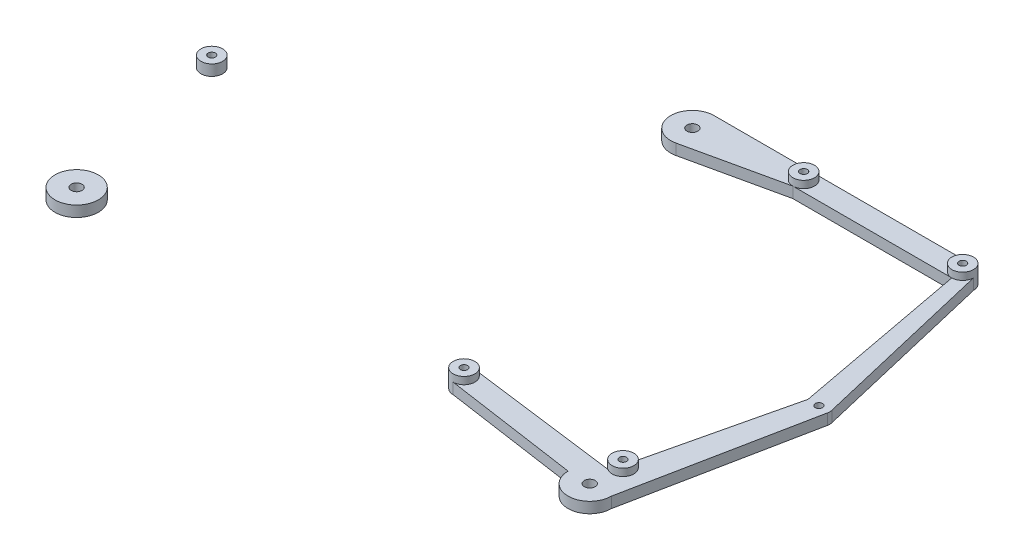
ISO-10303-21;
HEADER;
FILE_DESCRIPTION(('STEP AP214'),'2;1');
FILE_NAME('part.step','',(''),(''),'','','');
FILE_SCHEMA(('AUTOMOTIVE_DESIGN { 1 0 10303 214 1 1 1 1 }'));
ENDSEC;
DATA;
#1=APPLICATION_CONTEXT('core data for automotive mechanical design processes');
#2=APPLICATION_PROTOCOL_DEFINITION('international standard','automotive_design',2000,#1);
#3=PRODUCT_CONTEXT('',#1,'mechanical');
#4=PRODUCT('Part','Part','',(#3));
#5=PRODUCT_RELATED_PRODUCT_CATEGORY('part','',(#4));
#6=PRODUCT_DEFINITION_FORMATION('','',#4);
#7=PRODUCT_DEFINITION_CONTEXT('part definition',#1,'design');
#8=PRODUCT_DEFINITION('design','',#6,#7);
#9=PRODUCT_DEFINITION_SHAPE('','',#8);
#10=(LENGTH_UNIT() NAMED_UNIT(*) SI_UNIT(.MILLI.,.METRE.));
#11=(NAMED_UNIT(*) PLANE_ANGLE_UNIT() SI_UNIT($,.RADIAN.));
#12=(NAMED_UNIT(*) SI_UNIT($,.STERADIAN.) SOLID_ANGLE_UNIT());
#13=UNCERTAINTY_MEASURE_WITH_UNIT(LENGTH_MEASURE(1.E-05),#10,'distance_accuracy_value','');
#14=(GEOMETRIC_REPRESENTATION_CONTEXT(3) GLOBAL_UNCERTAINTY_ASSIGNED_CONTEXT((#13)) GLOBAL_UNIT_ASSIGNED_CONTEXT((#10,
#11,#12)) REPRESENTATION_CONTEXT('',''));
#15=CARTESIAN_POINT('',(0.,0.,0.));
#16=DIRECTION('',(0.,0.,1.));
#17=DIRECTION('',(1.,0.,0.));
#18=AXIS2_PLACEMENT_3D('',#15,#16,#17);
#19=CARTESIAN_POINT('',(-49.,56.5,38.35));
#20=DIRECTION('',(0.,1.,0.));
#21=DIRECTION('',(0.,0.,1.));
#22=AXIS2_PLACEMENT_3D('',#19,#20,#21);
#23=PLANE('',#22);
#24=CARTESIAN_POINT('',(-49.,56.5,38.35));
#25=DIRECTION('',(0.,1.,0.));
#26=DIRECTION('',(0.,0.,1.));
#27=AXIS2_PLACEMENT_3D('',#24,#25,#26);
#28=CIRCLE('',#27,3.);
#29=CARTESIAN_POINT('',(-49.,56.5,41.35));
#30=VERTEX_POINT('',#29);
#31=EDGE_CURVE('E11',#30,#30,#28,.T.);
#32=ORIENTED_EDGE('',*,*,#31,.T.);
#33=EDGE_LOOP('',(#32));
#34=FACE_BOUND('',#33,.T.);
#35=CARTESIAN_POINT('',(-49.,56.5,38.35));
#36=DIRECTION('',(0.,1.,0.));
#37=DIRECTION('',(0.,0.,1.));
#38=AXIS2_PLACEMENT_3D('',#35,#36,#37);
#39=CIRCLE('',#38,0.999999999999998);
#40=CARTESIAN_POINT('',(-49.,56.5,39.35));
#41=VERTEX_POINT('',#40);
#42=EDGE_CURVE('E58',#41,#41,#39,.T.);
#43=ORIENTED_EDGE('',*,*,#42,.F.);
#44=EDGE_LOOP('',(#43));
#45=FACE_BOUND('',#44,.T.);
#46=ADVANCED_FACE('F47',(#34,#45),#23,.T.);
#47=CARTESIAN_POINT('',(-49.,53.5,38.35));
#48=DIRECTION('',(0.,1.,0.));
#49=DIRECTION('',(0.,0.,1.));
#50=AXIS2_PLACEMENT_3D('',#47,#48,#49);
#51=PLANE('',#50);
#52=CARTESIAN_POINT('',(-49.,53.5,38.35));
#53=DIRECTION('',(0.,1.,0.));
#54=DIRECTION('',(0.,0.,1.));
#55=AXIS2_PLACEMENT_3D('',#52,#53,#54);
#56=CIRCLE('',#55,3.);
#57=CARTESIAN_POINT('',(-49.,53.5,41.35));
#58=VERTEX_POINT('',#57);
#59=EDGE_CURVE('E51',#58,#58,#56,.T.);
#60=ORIENTED_EDGE('',*,*,#59,.F.);
#61=EDGE_LOOP('',(#60));
#62=FACE_BOUND('',#61,.T.);
#63=CARTESIAN_POINT('',(-49.,53.5,38.35));
#64=DIRECTION('',(0.,1.,0.));
#65=DIRECTION('',(0.,0.,1.));
#66=AXIS2_PLACEMENT_3D('',#63,#64,#65);
#67=CIRCLE('',#66,0.999999999999998);
#68=CARTESIAN_POINT('',(-49.,53.5,39.35));
#69=VERTEX_POINT('',#68);
#70=EDGE_CURVE('E60',#69,#69,#67,.T.);
#71=ORIENTED_EDGE('',*,*,#70,.T.);
#72=EDGE_LOOP('',(#71));
#73=FACE_BOUND('',#72,.T.);
#74=ADVANCED_FACE('F70',(#62,#73),#51,.F.);
#75=CARTESIAN_POINT('',(-49.,56.5,38.35));
#76=DIRECTION('',(0.,-1.,0.));
#77=DIRECTION('',(0.,0.,-1.));
#78=AXIS2_PLACEMENT_3D('',#75,#76,#77);
#79=CYLINDRICAL_SURFACE('',#78,3.);
#80=ORIENTED_EDGE('',*,*,#31,.F.);
#81=EDGE_LOOP('',(#80));
#82=FACE_BOUND('',#81,.T.);
#83=ORIENTED_EDGE('',*,*,#59,.T.);
#84=EDGE_LOOP('',(#83));
#85=FACE_BOUND('',#84,.T.);
#86=ADVANCED_FACE('F49',(#82,#85),#79,.T.);
#87=CARTESIAN_POINT('',(-49.,56.5,38.35));
#88=DIRECTION('',(0.,-1.,0.));
#89=DIRECTION('',(0.,0.,-1.));
#90=AXIS2_PLACEMENT_3D('',#87,#88,#89);
#91=CYLINDRICAL_SURFACE('',#90,0.999999999999998);
#92=ORIENTED_EDGE('',*,*,#42,.T.);
#93=EDGE_LOOP('',(#92));
#94=FACE_BOUND('',#93,.T.);
#95=ORIENTED_EDGE('',*,*,#70,.F.);
#96=EDGE_LOOP('',(#95));
#97=FACE_BOUND('',#96,.T.);
#98=ADVANCED_FACE('F66',(#94,#97),#91,.F.);
#99=CLOSED_SHELL('',(#46,#74,#86,#98));
#100=MANIFOLD_SOLID_BREP('B2',#99);
#101=CARTESIAN_POINT('',(35.,56.5,-10.65));
#102=DIRECTION('',(0.,1.,0.));
#103=DIRECTION('',(0.,0.,1.));
#104=AXIS2_PLACEMENT_3D('',#101,#102,#103);
#105=PLANE('',#104);
#106=CARTESIAN_POINT('',(106.8,56.5,-13.65));
#107=DIRECTION('',(0.,1.,0.));
#108=DIRECTION('',(0.,0.,1.));
#109=AXIS2_PLACEMENT_3D('',#106,#107,#108);
#110=CIRCLE('',#109,3.00000000000001);
#111=CARTESIAN_POINT('',(106.8,56.5,-10.65));
#112=VERTEX_POINT('',#111);
#113=CARTESIAN_POINT('',(109.8,56.5,-13.65));
#114=VERTEX_POINT('',#113);
#115=EDGE_CURVE('E264',#112,#114,#110,.T.);
#116=ORIENTED_EDGE('',*,*,#115,.F.);
#117=DIRECTION('',(-0.184530735506142,0.,-0.982826743456629));
#118=VECTOR('',#117,1.);
#119=CARTESIAN_POINT('',(116.,56.5,38.35));
#120=LINE('',#119,#118);
#121=CARTESIAN_POINT('',(116.,56.5,38.35));
#122=VERTEX_POINT('',#121);
#123=EDGE_CURVE('E228',#122,#112,#120,.T.);
#124=ORIENTED_EDGE('',*,*,#123,.F.);
#125=DIRECTION('',(0.229595693571687,0.,-0.97328609231476));
#126=VECTOR('',#125,1.);
#127=CARTESIAN_POINT('',(106.8,56.5,77.35));
#128=LINE('',#127,#126);
#129=CARTESIAN_POINT('',(106.8,56.5,77.35));
#130=VERTEX_POINT('',#129);
#131=EDGE_CURVE('E250',#130,#122,#128,.T.);
#132=ORIENTED_EDGE('',*,*,#131,.F.);
#133=CARTESIAN_POINT('',(106.8,56.5,80.35));
#134=DIRECTION('',(0.,1.,0.));
#135=DIRECTION('',(0.,0.,1.));
#136=AXIS2_PLACEMENT_3D('',#133,#134,#135);
#137=CIRCLE('',#136,3.00000000000001);
#138=CARTESIAN_POINT('',(105.09529593426,56.5,82.8185996127867));
#139=VERTEX_POINT('',#138);
#140=EDGE_CURVE('E315',#139,#130,#137,.T.);
#141=ORIENTED_EDGE('',*,*,#140,.F.);
#142=DIRECTION('',(0.991669360604763,0.,0.128809468742559));
#143=VECTOR('',#142,1.);
#144=CARTESIAN_POINT('',(63.1864284062277,56.5,77.3749919181857));
#145=LINE('',#144,#143);
#146=CARTESIAN_POINT('',(63.1864284062277,56.5,77.3749919181857));
#147=VERTEX_POINT('',#146);
#148=EDGE_CURVE('E406',#147,#139,#145,.T.);
#149=ORIENTED_EDGE('',*,*,#148,.F.);
#150=CARTESIAN_POINT('',(62.8,56.5,80.35));
#151=DIRECTION('',(0.,1.,0.));
#152=DIRECTION('',(0.,0.,1.));
#153=AXIS2_PLACEMENT_3D('',#150,#151,#152);
#154=CIRCLE('',#153,3.00000000000001);
#155=CARTESIAN_POINT('',(62.8,56.5,83.35));
#156=VERTEX_POINT('',#155);
#157=EDGE_CURVE('E294',#156,#147,#154,.T.);
#158=ORIENTED_EDGE('',*,*,#157,.F.);
#159=DIRECTION('',(-0.989627736739852,0.,-0.143655639204171));
#160=VECTOR('',#159,1.);
#161=CARTESIAN_POINT('',(99.9999999999999,56.5,88.75));
#162=LINE('',#161,#160);
#163=CARTESIAN_POINT('',(99.9999999999999,56.5,88.75));
#164=VERTEX_POINT('',#163);
#165=EDGE_CURVE('E411',#164,#156,#162,.T.);
#166=ORIENTED_EDGE('',*,*,#165,.F.);
#167=CARTESIAN_POINT('',(106.,56.5,88.75));
#168=DIRECTION('',(0.,1.,0.));
#169=DIRECTION('',(0.,0.,1.));
#170=AXIS2_PLACEMENT_3D('',#167,#168,#169);
#171=CIRCLE('',#170,6.00000000000001);
#172=CARTESIAN_POINT('',(112.,56.5,88.75));
#173=VERTEX_POINT('',#172);
#174=EDGE_CURVE('E416',#173,#164,#171,.F.);
#175=ORIENTED_EDGE('',*,*,#174,.F.);
#176=DIRECTION('',(-0.195726385235334,0.,0.980658545122975));
#177=VECTOR('',#176,1.);
#178=CARTESIAN_POINT('',(112.,56.5,88.75));
#179=LINE('',#178,#177);
#180=CARTESIAN_POINT('',(121.941975635369,56.5,38.937179155706));
#181=VERTEX_POINT('',#180);
#182=EDGE_CURVE('E421',#181,#173,#179,.T.);
#183=ORIENTED_EDGE('',*,*,#182,.F.);
#184=CARTESIAN_POINT('',(119.,56.5,38.35));
#185=DIRECTION('',(0.,1.,0.));
#186=DIRECTION('',(0.,0.,1.));
#187=AXIS2_PLACEMENT_3D('',#184,#185,#186);
#188=CIRCLE('',#187,3.);
#189=CARTESIAN_POINT('',(121.9196588455,56.5,37.6603680504115));
#190=VERTEX_POINT('',#189);
#191=EDGE_CURVE('E426',#190,#181,#188,.F.);
#192=ORIENTED_EDGE('',*,*,#191,.F.);
#193=DIRECTION('',(0.229877316529491,0.,0.97321961516669));
#194=VECTOR('',#193,1.);
#195=CARTESIAN_POINT('',(109.8,56.5,-13.65));
#196=LINE('',#195,#194);
#197=EDGE_CURVE('E267',#114,#190,#196,.T.);
#198=ORIENTED_EDGE('',*,*,#197,.F.);
#199=EDGE_LOOP('',(#116,#124,#132,#141,#149,#158,#166,#175,#183,#192,#198));
#200=FACE_BOUND('',#199,.T.);
#201=CARTESIAN_POINT('',(119.,56.5,38.35));
#202=DIRECTION('',(0.,1.,0.));
#203=DIRECTION('',(0.,0.,1.));
#204=AXIS2_PLACEMENT_3D('',#201,#202,#203);
#205=CIRCLE('',#204,0.999999999999998);
#206=CARTESIAN_POINT('',(119.,56.5,39.35));
#207=VERTEX_POINT('',#206);
#208=EDGE_CURVE('E398',#207,#207,#205,.F.);
#209=ORIENTED_EDGE('',*,*,#208,.T.);
#210=EDGE_LOOP('',(#209));
#211=FACE_BOUND('',#210,.T.);
#212=CARTESIAN_POINT('',(106.,56.5,88.75));
#213=DIRECTION('',(0.,1.,0.));
#214=DIRECTION('',(0.,0.,1.));
#215=AXIS2_PLACEMENT_3D('',#212,#213,#214);
#216=CIRCLE('',#215,1.5);
#217=CARTESIAN_POINT('',(106.,56.5,90.25));
#218=VERTEX_POINT('',#217);
#219=EDGE_CURVE('E324',#218,#218,#216,.F.);
#220=ORIENTED_EDGE('',*,*,#219,.T.);
#221=EDGE_LOOP('',(#220));
#222=FACE_BOUND('',#221,.T.);
#223=ADVANCED_FACE('F116',(#200,#211,#222),#105,.T.);
#224=CARTESIAN_POINT('',(106.8,56.5,-16.65));
#225=VERTEX_POINT('',#224);
#226=EDGE_CURVE('E256',#225,#112,#110,.T.);
#227=ORIENTED_EDGE('',*,*,#226,.F.);
#228=DIRECTION('',(1.,0.,0.));
#229=VECTOR('',#228,1.);
#230=CARTESIAN_POINT('',(106.8,56.5,-16.65));
#231=LINE('',#230,#229);
#232=CARTESIAN_POINT('',(62.8,56.5,-16.65));
#233=VERTEX_POINT('',#232);
#234=EDGE_CURVE('E437',#233,#225,#231,.T.);
#235=ORIENTED_EDGE('',*,*,#234,.F.);
#236=CARTESIAN_POINT('',(62.8,56.5,-13.65));
#237=DIRECTION('',(0.,1.,0.));
#238=DIRECTION('',(0.,0.,1.));
#239=AXIS2_PLACEMENT_3D('',#236,#237,#238);
#240=CIRCLE('',#239,3.00000000000001);
#241=CARTESIAN_POINT('',(62.8,56.5,-10.65));
#242=VERTEX_POINT('',#241);
#243=EDGE_CURVE('E259',#242,#233,#240,.T.);
#244=ORIENTED_EDGE('',*,*,#243,.F.);
#245=DIRECTION('',(-1.,0.,0.));
#246=VECTOR('',#245,1.);
#247=CARTESIAN_POINT('',(62.8,56.5,-10.65));
#248=LINE('',#247,#246);
#249=EDGE_CURVE('E244',#112,#242,#248,.T.);
#250=ORIENTED_EDGE('',*,*,#249,.F.);
#251=EDGE_LOOP('',(#227,#235,#244,#250));
#252=FACE_BOUND('',#251,.T.);
#253=ADVANCED_FACE('F254',(#252),#105,.T.);
#254=EDGE_CURVE('E132',#233,#242,#240,.T.);
#255=ORIENTED_EDGE('',*,*,#254,.F.);
#256=CARTESIAN_POINT('',(35.,56.5,-16.65));
#257=VERTEX_POINT('',#256);
#258=EDGE_CURVE('E434',#257,#233,#231,.T.);
#259=ORIENTED_EDGE('',*,*,#258,.F.);
#260=CARTESIAN_POINT('',(35.,56.5,-10.65));
#261=DIRECTION('',(0.,1.,0.));
#262=DIRECTION('',(0.,0.,1.));
#263=AXIS2_PLACEMENT_3D('',#260,#261,#262);
#264=CIRCLE('',#263,5.99999999999999);
#265=CARTESIAN_POINT('',(36.294964028777,56.5,-4.79141073600707));
#266=VERTEX_POINT('',#265);
#267=EDGE_CURVE('E45',#257,#266,#264,.T.);
#268=ORIENTED_EDGE('',*,*,#267,.T.);
#269=DIRECTION('',(-0.976431543998829,0.,0.215827338129495));
#270=VECTOR('',#269,1.);
#271=CARTESIAN_POINT('',(36.294964028777,56.5,-4.79141073600707));
#272=LINE('',#271,#270);
#273=EDGE_CURVE('E438',#242,#266,#272,.T.);
#274=ORIENTED_EDGE('',*,*,#273,.F.);
#275=EDGE_LOOP('',(#255,#259,#268,#274));
#276=FACE_BOUND('',#275,.T.);
#277=CARTESIAN_POINT('',(35.,56.5,-10.65));
#278=DIRECTION('',(0.,1.,0.));
#279=DIRECTION('',(0.,0.,1.));
#280=AXIS2_PLACEMENT_3D('',#277,#278,#279);
#281=CIRCLE('',#280,1.5);
#282=CARTESIAN_POINT('',(35.,56.5,-9.15000000000002));
#283=VERTEX_POINT('',#282);
#284=EDGE_CURVE('E472',#283,#283,#281,.T.);
#285=ORIENTED_EDGE('',*,*,#284,.F.);
#286=EDGE_LOOP('',(#285));
#287=FACE_BOUND('',#286,.T.);
#288=ADVANCED_FACE('F499',(#276,#287),#105,.T.);
#289=CARTESIAN_POINT('',(35.,53.5,-10.65));
#290=DIRECTION('',(0.,1.,0.));
#291=DIRECTION('',(0.,0.,1.));
#292=AXIS2_PLACEMENT_3D('',#289,#290,#291);
#293=PLANE('',#292);
#294=DIRECTION('',(1.,0.,0.));
#295=VECTOR('',#294,1.);
#296=CARTESIAN_POINT('',(106.8,53.5,-16.65));
#297=LINE('',#296,#295);
#298=CARTESIAN_POINT('',(35.,53.5,-16.65));
#299=VERTEX_POINT('',#298);
#300=CARTESIAN_POINT('',(106.8,53.5,-16.65));
#301=VERTEX_POINT('',#300);
#302=EDGE_CURVE('E345',#299,#301,#297,.T.);
#303=ORIENTED_EDGE('',*,*,#302,.T.);
#304=CARTESIAN_POINT('',(106.8,53.5,-13.65));
#305=DIRECTION('',(0.,-1.,0.));
#306=DIRECTION('',(0.,0.,-1.));
#307=AXIS2_PLACEMENT_3D('',#304,#305,#306);
#308=CIRCLE('',#307,3.00000000000001);
#309=CARTESIAN_POINT('',(109.8,53.5,-13.65));
#310=VERTEX_POINT('',#309);
#311=EDGE_CURVE('E341',#301,#310,#308,.T.);
#312=ORIENTED_EDGE('',*,*,#311,.T.);
#313=DIRECTION('',(0.229877316529491,0.,0.97321961516669));
#314=VECTOR('',#313,1.);
#315=CARTESIAN_POINT('',(109.8,53.5,-13.65));
#316=LINE('',#315,#314);
#317=CARTESIAN_POINT('',(121.9196588455,53.5,37.6603680504115));
#318=VERTEX_POINT('',#317);
#319=EDGE_CURVE('E337',#310,#318,#316,.T.);
#320=ORIENTED_EDGE('',*,*,#319,.T.);
#321=CARTESIAN_POINT('',(119.,53.5,38.35));
#322=DIRECTION('',(0.,-1.,0.));
#323=DIRECTION('',(0.,0.,-1.));
#324=AXIS2_PLACEMENT_3D('',#321,#322,#323);
#325=CIRCLE('',#324,3.);
#326=CARTESIAN_POINT('',(121.941975635369,53.5,38.937179155706));
#327=VERTEX_POINT('',#326);
#328=EDGE_CURVE('E333',#318,#327,#325,.T.);
#329=ORIENTED_EDGE('',*,*,#328,.T.);
#330=DIRECTION('',(-0.195726385235334,0.,0.980658545122975));
#331=VECTOR('',#330,1.);
#332=CARTESIAN_POINT('',(112.,53.5,88.75));
#333=LINE('',#332,#331);
#334=CARTESIAN_POINT('',(112.,53.5,88.75));
#335=VERTEX_POINT('',#334);
#336=EDGE_CURVE('E329',#327,#335,#333,.T.);
#337=ORIENTED_EDGE('',*,*,#336,.T.);
#338=CARTESIAN_POINT('',(106.,53.5,88.75));
#339=DIRECTION('',(0.,-1.,0.));
#340=DIRECTION('',(0.,0.,-1.));
#341=AXIS2_PLACEMENT_3D('',#338,#339,#340);
#342=CIRCLE('',#341,6.00000000000001);
#343=CARTESIAN_POINT('',(99.9999999999999,53.5,88.75));
#344=VERTEX_POINT('',#343);
#345=EDGE_CURVE('E325',#335,#344,#342,.T.);
#346=ORIENTED_EDGE('',*,*,#345,.T.);
#347=DIRECTION('',(-0.989627736739852,0.,-0.143655639204171));
#348=VECTOR('',#347,1.);
#349=CARTESIAN_POINT('',(99.9999999999999,53.5,88.75));
#350=LINE('',#349,#348);
#351=CARTESIAN_POINT('',(62.8,53.5,83.35));
#352=VERTEX_POINT('',#351);
#353=EDGE_CURVE('E320',#344,#352,#350,.T.);
#354=ORIENTED_EDGE('',*,*,#353,.T.);
#355=CARTESIAN_POINT('',(62.8,53.5,80.35));
#356=DIRECTION('',(0.,-1.,0.));
#357=DIRECTION('',(0.,0.,-1.));
#358=AXIS2_PLACEMENT_3D('',#355,#356,#357);
#359=CIRCLE('',#358,3.);
#360=CARTESIAN_POINT('',(63.1864284062277,53.5,77.3749919181857));
#361=VERTEX_POINT('',#360);
#362=EDGE_CURVE('E369',#352,#361,#359,.T.);
#363=ORIENTED_EDGE('',*,*,#362,.T.);
#364=DIRECTION('',(0.991669360604763,0.,0.128809468742559));
#365=VECTOR('',#364,1.);
#366=CARTESIAN_POINT('',(63.1864284062277,53.5,77.3749919181857));
#367=LINE('',#366,#365);
#368=CARTESIAN_POINT('',(105.09529593426,53.5,82.8185996127867));
#369=VERTEX_POINT('',#368);
#370=EDGE_CURVE('E365',#361,#369,#367,.T.);
#371=ORIENTED_EDGE('',*,*,#370,.T.);
#372=CARTESIAN_POINT('',(106.8,53.5,80.35));
#373=DIRECTION('',(0.,-1.,0.));
#374=DIRECTION('',(0.,0.,-1.));
#375=AXIS2_PLACEMENT_3D('',#372,#373,#374);
#376=CIRCLE('',#375,3.00000000000001);
#377=CARTESIAN_POINT('',(106.8,53.5,77.35));
#378=VERTEX_POINT('',#377);
#379=EDGE_CURVE('E361',#369,#378,#376,.T.);
#380=ORIENTED_EDGE('',*,*,#379,.T.);
#381=DIRECTION('',(0.229595693571687,0.,-0.97328609231476));
#382=VECTOR('',#381,1.);
#383=CARTESIAN_POINT('',(106.8,53.5,77.35));
#384=LINE('',#383,#382);
#385=CARTESIAN_POINT('',(116.,53.5,38.35));
#386=VERTEX_POINT('',#385);
#387=EDGE_CURVE('E357',#378,#386,#384,.T.);
#388=ORIENTED_EDGE('',*,*,#387,.T.);
#389=DIRECTION('',(-0.184530735506142,0.,-0.982826743456629));
#390=VECTOR('',#389,1.);
#391=CARTESIAN_POINT('',(116.,53.5,38.35));
#392=LINE('',#391,#390);
#393=CARTESIAN_POINT('',(106.8,53.5,-10.65));
#394=VERTEX_POINT('',#393);
#395=EDGE_CURVE('E354',#386,#394,#392,.T.);
#396=ORIENTED_EDGE('',*,*,#395,.T.);
#397=DIRECTION('',(-1.,0.,0.));
#398=VECTOR('',#397,1.);
#399=CARTESIAN_POINT('',(62.8,53.5,-10.65));
#400=LINE('',#399,#398);
#401=CARTESIAN_POINT('',(62.8,53.5,-10.65));
#402=VERTEX_POINT('',#401);
#403=EDGE_CURVE('E247',#394,#402,#400,.T.);
#404=ORIENTED_EDGE('',*,*,#403,.T.);
#405=DIRECTION('',(-0.976431543998829,0.,0.215827338129495));
#406=VECTOR('',#405,1.);
#407=CARTESIAN_POINT('',(36.294964028777,53.5,-4.79141073600707));
#408=LINE('',#407,#406);
#409=CARTESIAN_POINT('',(36.294964028777,53.5,-4.79141073600707));
#410=VERTEX_POINT('',#409);
#411=EDGE_CURVE('E348',#402,#410,#408,.T.);
#412=ORIENTED_EDGE('',*,*,#411,.T.);
#413=CARTESIAN_POINT('',(35.,53.5,-10.65));
#414=DIRECTION('',(0.,1.,0.));
#415=DIRECTION('',(0.,0.,1.));
#416=AXIS2_PLACEMENT_3D('',#413,#414,#415);
#417=CIRCLE('',#416,5.99999999999999);
#418=EDGE_CURVE('E120',#299,#410,#417,.T.);
#419=ORIENTED_EDGE('',*,*,#418,.F.);
#420=EDGE_LOOP('',(#303,#312,#320,#329,#337,#346,#354,#363,#371,#380,#388,#396,#404,#412,#419));
#421=FACE_BOUND('',#420,.T.);
#422=CARTESIAN_POINT('',(35.,53.5,-10.65));
#423=DIRECTION('',(0.,1.,0.));
#424=DIRECTION('',(0.,0.,1.));
#425=AXIS2_PLACEMENT_3D('',#422,#423,#424);
#426=CIRCLE('',#425,1.5);
#427=CARTESIAN_POINT('',(35.,53.5,-9.15000000000002));
#428=VERTEX_POINT('',#427);
#429=EDGE_CURVE('E402',#428,#428,#426,.T.);
#430=ORIENTED_EDGE('',*,*,#429,.T.);
#431=EDGE_LOOP('',(#430));
#432=FACE_BOUND('',#431,.T.);
#433=CARTESIAN_POINT('',(62.8,53.5,-13.65));
#434=DIRECTION('',(0.,-1.,0.));
#435=DIRECTION('',(0.,0.,-1.));
#436=AXIS2_PLACEMENT_3D('',#433,#434,#435);
#437=CIRCLE('',#436,0.999999999999998);
#438=CARTESIAN_POINT('',(62.8,53.5,-14.65));
#439=VERTEX_POINT('',#438);
#440=EDGE_CURVE('E383',#439,#439,#437,.T.);
#441=ORIENTED_EDGE('',*,*,#440,.F.);
#442=EDGE_LOOP('',(#441));
#443=FACE_BOUND('',#442,.T.);
#444=CARTESIAN_POINT('',(106.8,53.5,-13.65));
#445=DIRECTION('',(0.,-1.,0.));
#446=DIRECTION('',(0.,0.,-1.));
#447=AXIS2_PLACEMENT_3D('',#444,#445,#446);
#448=CIRCLE('',#447,0.999999999999998);
#449=CARTESIAN_POINT('',(106.8,53.5,-14.65));
#450=VERTEX_POINT('',#449);
#451=EDGE_CURVE('E378',#450,#450,#448,.T.);
#452=ORIENTED_EDGE('',*,*,#451,.F.);
#453=EDGE_LOOP('',(#452));
#454=FACE_BOUND('',#453,.T.);
#455=CARTESIAN_POINT('',(62.8,53.5,80.35));
#456=DIRECTION('',(0.,-1.,0.));
#457=DIRECTION('',(0.,0.,-1.));
#458=AXIS2_PLACEMENT_3D('',#455,#456,#457);
#459=CIRCLE('',#458,0.999999999999998);
#460=CARTESIAN_POINT('',(62.8,53.5,79.35));
#461=VERTEX_POINT('',#460);
#462=EDGE_CURVE('E373',#461,#461,#459,.T.);
#463=ORIENTED_EDGE('',*,*,#462,.F.);
#464=EDGE_LOOP('',(#463));
#465=FACE_BOUND('',#464,.T.);
#466=CARTESIAN_POINT('',(106.8,53.5,80.35));
#467=DIRECTION('',(0.,-1.,0.));
#468=DIRECTION('',(0.,0.,-1.));
#469=AXIS2_PLACEMENT_3D('',#466,#467,#468);
#470=CIRCLE('',#469,0.999999999999998);
#471=CARTESIAN_POINT('',(106.8,53.5,79.35));
#472=VERTEX_POINT('',#471);
#473=EDGE_CURVE('E391',#472,#472,#470,.T.);
#474=ORIENTED_EDGE('',*,*,#473,.F.);
#475=EDGE_LOOP('',(#474));
#476=FACE_BOUND('',#475,.T.);
#477=CARTESIAN_POINT('',(106.,53.5,88.75));
#478=DIRECTION('',(0.,-1.,0.));
#479=DIRECTION('',(0.,0.,-1.));
#480=AXIS2_PLACEMENT_3D('',#477,#478,#479);
#481=CIRCLE('',#480,1.5);
#482=CARTESIAN_POINT('',(106.,53.5,87.25));
#483=VERTEX_POINT('',#482);
#484=EDGE_CURVE('E387',#483,#483,#481,.T.);
#485=ORIENTED_EDGE('',*,*,#484,.F.);
#486=EDGE_LOOP('',(#485));
#487=FACE_BOUND('',#486,.T.);
#488=CARTESIAN_POINT('',(119.,53.5,38.35));
#489=DIRECTION('',(0.,-1.,0.));
#490=DIRECTION('',(0.,0.,-1.));
#491=AXIS2_PLACEMENT_3D('',#488,#489,#490);
#492=CIRCLE('',#491,0.999999999999998);
#493=CARTESIAN_POINT('',(119.,53.5,37.35));
#494=VERTEX_POINT('',#493);
#495=EDGE_CURVE('E374',#494,#494,#492,.T.);
#496=ORIENTED_EDGE('',*,*,#495,.F.);
#497=EDGE_LOOP('',(#496));
#498=FACE_BOUND('',#497,.T.);
#499=ADVANCED_FACE('F480',(#421,#432,#443,#454,#465,#476,#487,#498),#293,.F.);
#500=CARTESIAN_POINT('',(35.,56.5,-10.65));
#501=DIRECTION('',(0.,-1.,0.));
#502=DIRECTION('',(0.,0.,-1.));
#503=AXIS2_PLACEMENT_3D('',#500,#501,#502);
#504=CYLINDRICAL_SURFACE('',#503,5.99999999999999);
#505=ORIENTED_EDGE('',*,*,#267,.F.);
#506=DIRECTION('',(0.,-1.,0.));
#507=VECTOR('',#506,1.);
#508=CARTESIAN_POINT('',(35.,201.61705619947,-16.65));
#509=LINE('',#508,#507);
#510=EDGE_CURVE('E140',#257,#299,#509,.T.);
#511=ORIENTED_EDGE('',*,*,#510,.T.);
#512=ORIENTED_EDGE('',*,*,#418,.T.);
#513=DIRECTION('',(0.,-1.,0.));
#514=VECTOR('',#513,1.);
#515=CARTESIAN_POINT('',(36.294964028777,201.61705619947,-4.79141073600707));
#516=LINE('',#515,#514);
#517=EDGE_CURVE('E261',#266,#410,#516,.T.);
#518=ORIENTED_EDGE('',*,*,#517,.F.);
#519=EDGE_LOOP('',(#505,#511,#512,#518));
#520=FACE_BOUND('',#519,.T.);
#521=ADVANCED_FACE('F118',(#520),#504,.T.);
#522=CARTESIAN_POINT('',(35.,56.5,-10.65));
#523=DIRECTION('',(0.,-1.,0.));
#524=DIRECTION('',(0.,0.,-1.));
#525=AXIS2_PLACEMENT_3D('',#522,#523,#524);
#526=CYLINDRICAL_SURFACE('',#525,1.5);
#527=ORIENTED_EDGE('',*,*,#284,.T.);
#528=EDGE_LOOP('',(#527));
#529=FACE_BOUND('',#528,.T.);
#530=ORIENTED_EDGE('',*,*,#429,.F.);
#531=EDGE_LOOP('',(#530));
#532=FACE_BOUND('',#531,.T.);
#533=ADVANCED_FACE('F483',(#529,#532),#526,.F.);
#534=CARTESIAN_POINT('',(62.8,201.61705619947,80.35));
#535=DIRECTION('',(0.,-1.,0.));
#536=DIRECTION('',(0.,0.,-1.));
#537=AXIS2_PLACEMENT_3D('',#534,#535,#536);
#538=CYLINDRICAL_SURFACE('',#537,3.);
#539=DIRECTION('',(0.,-1.,0.));
#540=VECTOR('',#539,1.);
#541=CARTESIAN_POINT('',(62.8,201.61705619947,83.35));
#542=LINE('',#541,#540);
#543=EDGE_CURVE('E415',#156,#352,#542,.T.);
#544=ORIENTED_EDGE('',*,*,#543,.F.);
#545=ORIENTED_EDGE('',*,*,#157,.T.);
#546=DIRECTION('',(0.,-1.,0.));
#547=VECTOR('',#546,1.);
#548=CARTESIAN_POINT('',(63.1864284062277,201.61705619947,77.3749919181857));
#549=LINE('',#548,#547);
#550=EDGE_CURVE('E319',#147,#361,#549,.T.);
#551=ORIENTED_EDGE('',*,*,#550,.T.);
#552=ORIENTED_EDGE('',*,*,#362,.F.);
#553=EDGE_LOOP('',(#544,#545,#551,#552));
#554=FACE_BOUND('',#553,.T.);
#555=CARTESIAN_POINT('',(62.8,58.5,80.35));
#556=DIRECTION('',(0.,1.,0.));
#557=DIRECTION('',(0.,0.,1.));
#558=AXIS2_PLACEMENT_3D('',#555,#556,#557);
#559=CIRCLE('',#558,3.00000000000001);
#560=CARTESIAN_POINT('',(62.8,58.5,83.35));
#561=VERTEX_POINT('',#560);
#562=EDGE_CURVE('E290',#561,#561,#559,.T.);
#563=ORIENTED_EDGE('',*,*,#562,.F.);
#564=EDGE_LOOP('',(#563));
#565=FACE_BOUND('',#564,.T.);
#566=ADVANCED_FACE('F485',(#554,#565),#538,.T.);
#567=CARTESIAN_POINT('',(99.9999999999999,201.61705619947,88.75));
#568=DIRECTION('',(-0.143655639204171,0.,0.989627736739852));
#569=DIRECTION('',(0.989627736739852,0.,0.143655639204171));
#570=AXIS2_PLACEMENT_3D('',#567,#568,#569);
#571=PLANE('',#570);
#572=DIRECTION('',(0.,-1.,0.));
#573=VECTOR('',#572,1.);
#574=CARTESIAN_POINT('',(99.9999999999999,201.61705619947,88.75));
#575=LINE('',#574,#573);
#576=EDGE_CURVE('E420',#164,#344,#575,.T.);
#577=ORIENTED_EDGE('',*,*,#576,.F.);
#578=ORIENTED_EDGE('',*,*,#165,.T.);
#579=ORIENTED_EDGE('',*,*,#543,.T.);
#580=ORIENTED_EDGE('',*,*,#353,.F.);
#581=EDGE_LOOP('',(#577,#578,#579,#580));
#582=FACE_BOUND('',#581,.T.);
#583=ADVANCED_FACE('F492',(#582),#571,.T.);
#584=CARTESIAN_POINT('',(106.,201.61705619947,88.75));
#585=DIRECTION('',(0.,-1.,0.));
#586=DIRECTION('',(0.,0.,-1.));
#587=AXIS2_PLACEMENT_3D('',#584,#585,#586);
#588=CYLINDRICAL_SURFACE('',#587,6.00000000000001);
#589=DIRECTION('',(0.,-1.,0.));
#590=VECTOR('',#589,1.);
#591=CARTESIAN_POINT('',(112.,201.61705619947,88.75));
#592=LINE('',#591,#590);
#593=EDGE_CURVE('E425',#173,#335,#592,.T.);
#594=ORIENTED_EDGE('',*,*,#593,.F.);
#595=ORIENTED_EDGE('',*,*,#174,.T.);
#596=ORIENTED_EDGE('',*,*,#576,.T.);
#597=ORIENTED_EDGE('',*,*,#345,.F.);
#598=EDGE_LOOP('',(#594,#595,#596,#597));
#599=FACE_BOUND('',#598,.T.);
#600=ADVANCED_FACE('F529',(#599),#588,.T.);
#601=CARTESIAN_POINT('',(112.,201.61705619947,88.75));
#602=DIRECTION('',(0.980658545122975,0.,0.195726385235334));
#603=DIRECTION('',(0.195726385235334,0.,-0.980658545122975));
#604=AXIS2_PLACEMENT_3D('',#601,#602,#603);
#605=PLANE('',#604);
#606=DIRECTION('',(0.,-1.,0.));
#607=VECTOR('',#606,1.);
#608=CARTESIAN_POINT('',(121.941975635369,201.61705619947,38.937179155706));
#609=LINE('',#608,#607);
#610=EDGE_CURVE('E430',#181,#327,#609,.T.);
#611=ORIENTED_EDGE('',*,*,#610,.F.);
#612=ORIENTED_EDGE('',*,*,#182,.T.);
#613=ORIENTED_EDGE('',*,*,#593,.T.);
#614=ORIENTED_EDGE('',*,*,#336,.F.);
#615=EDGE_LOOP('',(#611,#612,#613,#614));
#616=FACE_BOUND('',#615,.T.);
#617=ADVANCED_FACE('F525',(#616),#605,.T.);
#618=CARTESIAN_POINT('',(119.,201.61705619947,38.35));
#619=DIRECTION('',(0.,-1.,0.));
#620=DIRECTION('',(0.,0.,-1.));
#621=AXIS2_PLACEMENT_3D('',#618,#619,#620);
#622=CYLINDRICAL_SURFACE('',#621,3.);
#623=DIRECTION('',(0.,-1.,0.));
#624=VECTOR('',#623,1.);
#625=CARTESIAN_POINT('',(121.9196588455,201.61705619947,37.6603680504115));
#626=LINE('',#625,#624);
#627=EDGE_CURVE('E433',#190,#318,#626,.T.);
#628=ORIENTED_EDGE('',*,*,#627,.F.);
#629=ORIENTED_EDGE('',*,*,#191,.T.);
#630=ORIENTED_EDGE('',*,*,#610,.T.);
#631=ORIENTED_EDGE('',*,*,#328,.F.);
#632=EDGE_LOOP('',(#628,#629,#630,#631));
#633=FACE_BOUND('',#632,.T.);
#634=ADVANCED_FACE('F522',(#633),#622,.T.);
#635=CARTESIAN_POINT('',(109.8,201.61705619947,-13.65));
#636=DIRECTION('',(0.97321961516669,0.,-0.229877316529491));
#637=DIRECTION('',(-0.229877316529491,0.,-0.97321961516669));
#638=AXIS2_PLACEMENT_3D('',#635,#636,#637);
#639=PLANE('',#638);
#640=DIRECTION('',(0.,-1.,0.));
#641=VECTOR('',#640,1.);
#642=CARTESIAN_POINT('',(109.8,201.61705619947,-13.65));
#643=LINE('',#642,#641);
#644=EDGE_CURVE('E453',#114,#310,#643,.T.);
#645=ORIENTED_EDGE('',*,*,#644,.F.);
#646=ORIENTED_EDGE('',*,*,#197,.T.);
#647=ORIENTED_EDGE('',*,*,#627,.T.);
#648=ORIENTED_EDGE('',*,*,#319,.F.);
#649=EDGE_LOOP('',(#645,#646,#647,#648));
#650=FACE_BOUND('',#649,.T.);
#651=ADVANCED_FACE('F517',(#650),#639,.T.);
#652=CARTESIAN_POINT('',(106.8,201.61705619947,-13.65));
#653=DIRECTION('',(0.,-1.,0.));
#654=DIRECTION('',(0.,0.,-1.));
#655=AXIS2_PLACEMENT_3D('',#652,#653,#654);
#656=CYLINDRICAL_SURFACE('',#655,3.00000000000001);
#657=DIRECTION('',(0.,-1.,0.));
#658=VECTOR('',#657,1.);
#659=CARTESIAN_POINT('',(106.8,201.61705619947,-16.65));
#660=LINE('',#659,#658);
#661=EDGE_CURVE('E278',#225,#301,#660,.T.);
#662=ORIENTED_EDGE('',*,*,#661,.F.);
#663=ORIENTED_EDGE('',*,*,#226,.T.);
#664=ORIENTED_EDGE('',*,*,#115,.T.);
#665=ORIENTED_EDGE('',*,*,#644,.T.);
#666=ORIENTED_EDGE('',*,*,#311,.F.);
#667=EDGE_LOOP('',(#662,#663,#664,#665,#666));
#668=FACE_BOUND('',#667,.T.);
#669=CARTESIAN_POINT('',(106.8,58.5,-13.65));
#670=DIRECTION('',(0.,1.,0.));
#671=DIRECTION('',(0.,0.,1.));
#672=AXIS2_PLACEMENT_3D('',#669,#670,#671);
#673=CIRCLE('',#672,3.00000000000001);
#674=CARTESIAN_POINT('',(106.8,58.5,-10.65));
#675=VERTEX_POINT('',#674);
#676=EDGE_CURVE('E280',#675,#675,#673,.T.);
#677=ORIENTED_EDGE('',*,*,#676,.F.);
#678=EDGE_LOOP('',(#677));
#679=FACE_BOUND('',#678,.T.);
#680=ADVANCED_FACE('F274',(#668,#679),#656,.T.);
#681=CARTESIAN_POINT('',(106.8,201.61705619947,-16.65));
#682=DIRECTION('',(0.,0.,-1.));
#683=DIRECTION('',(-1.,0.,0.));
#684=AXIS2_PLACEMENT_3D('',#681,#682,#683);
#685=PLANE('',#684);
#686=ORIENTED_EDGE('',*,*,#258,.T.);
#687=ORIENTED_EDGE('',*,*,#234,.T.);
#688=ORIENTED_EDGE('',*,*,#661,.T.);
#689=ORIENTED_EDGE('',*,*,#302,.F.);
#690=ORIENTED_EDGE('',*,*,#510,.F.);
#691=EDGE_LOOP('',(#686,#687,#688,#689,#690));
#692=FACE_BOUND('',#691,.T.);
#693=ADVANCED_FACE('F514',(#692),#685,.T.);
#694=CARTESIAN_POINT('',(36.294964028777,201.61705619947,-4.79141073600707));
#695=DIRECTION('',(0.215827338129495,0.,0.976431543998829));
#696=DIRECTION('',(0.976431543998829,0.,-0.215827338129495));
#697=AXIS2_PLACEMENT_3D('',#694,#695,#696);
#698=PLANE('',#697);
#699=DIRECTION('',(0.,-1.,0.));
#700=VECTOR('',#699,1.);
#701=CARTESIAN_POINT('',(62.8,201.61705619947,-10.65));
#702=LINE('',#701,#700);
#703=EDGE_CURVE('E239',#242,#402,#702,.T.);
#704=ORIENTED_EDGE('',*,*,#703,.F.);
#705=ORIENTED_EDGE('',*,*,#273,.T.);
#706=ORIENTED_EDGE('',*,*,#517,.T.);
#707=ORIENTED_EDGE('',*,*,#411,.F.);
#708=EDGE_LOOP('',(#704,#705,#706,#707));
#709=FACE_BOUND('',#708,.T.);
#710=ADVANCED_FACE('F624',(#709),#698,.T.);
#711=CARTESIAN_POINT('',(62.8,201.61705619947,-10.65));
#712=DIRECTION('',(0.,0.,1.));
#713=DIRECTION('',(1.,0.,0.));
#714=AXIS2_PLACEMENT_3D('',#711,#712,#713);
#715=PLANE('',#714);
#716=DIRECTION('',(0.,-1.,0.));
#717=VECTOR('',#716,1.);
#718=CARTESIAN_POINT('',(106.8,201.61705619947,-10.65));
#719=LINE('',#718,#717);
#720=EDGE_CURVE('E232',#112,#394,#719,.T.);
#721=ORIENTED_EDGE('',*,*,#720,.F.);
#722=ORIENTED_EDGE('',*,*,#249,.T.);
#723=ORIENTED_EDGE('',*,*,#703,.T.);
#724=ORIENTED_EDGE('',*,*,#403,.F.);
#725=EDGE_LOOP('',(#721,#722,#723,#724));
#726=FACE_BOUND('',#725,.T.);
#727=ADVANCED_FACE('F243',(#726),#715,.T.);
#728=CARTESIAN_POINT('',(116.,201.61705619947,38.35));
#729=DIRECTION('',(-0.982826743456629,0.,0.184530735506142));
#730=DIRECTION('',(0.184530735506142,0.,0.982826743456629));
#731=AXIS2_PLACEMENT_3D('',#728,#729,#730);
#732=PLANE('',#731);
#733=DIRECTION('',(0.,-1.,0.));
#734=VECTOR('',#733,1.);
#735=CARTESIAN_POINT('',(116.,201.61705619947,38.35));
#736=LINE('',#735,#734);
#737=EDGE_CURVE('E234',#122,#386,#736,.T.);
#738=ORIENTED_EDGE('',*,*,#737,.F.);
#739=ORIENTED_EDGE('',*,*,#123,.T.);
#740=ORIENTED_EDGE('',*,*,#720,.T.);
#741=ORIENTED_EDGE('',*,*,#395,.F.);
#742=EDGE_LOOP('',(#738,#739,#740,#741));
#743=FACE_BOUND('',#742,.T.);
#744=ADVANCED_FACE('F230',(#743),#732,.T.);
#745=CARTESIAN_POINT('',(106.8,201.61705619947,77.35));
#746=DIRECTION('',(-0.97328609231476,0.,-0.229595693571687));
#747=DIRECTION('',(-0.229595693571687,0.,0.97328609231476));
#748=AXIS2_PLACEMENT_3D('',#745,#746,#747);
#749=PLANE('',#748);
#750=DIRECTION('',(0.,-1.,0.));
#751=VECTOR('',#750,1.);
#752=CARTESIAN_POINT('',(106.8,201.61705619947,77.35));
#753=LINE('',#752,#751);
#754=EDGE_CURVE('E410',#130,#378,#753,.T.);
#755=ORIENTED_EDGE('',*,*,#754,.F.);
#756=ORIENTED_EDGE('',*,*,#131,.T.);
#757=ORIENTED_EDGE('',*,*,#737,.T.);
#758=ORIENTED_EDGE('',*,*,#387,.F.);
#759=EDGE_LOOP('',(#755,#756,#757,#758));
#760=FACE_BOUND('',#759,.T.);
#761=ADVANCED_FACE('F549',(#760),#749,.T.);
#762=CARTESIAN_POINT('',(106.8,201.61705619947,80.35));
#763=DIRECTION('',(0.,-1.,0.));
#764=DIRECTION('',(0.,0.,-1.));
#765=AXIS2_PLACEMENT_3D('',#762,#763,#764);
#766=CYLINDRICAL_SURFACE('',#765,3.00000000000001);
#767=DIRECTION('',(0.,-1.,0.));
#768=VECTOR('',#767,1.);
#769=CARTESIAN_POINT('',(105.09529593426,201.61705619947,82.8185996127867));
#770=LINE('',#769,#768);
#771=EDGE_CURVE('E379',#139,#369,#770,.T.);
#772=ORIENTED_EDGE('',*,*,#771,.F.);
#773=ORIENTED_EDGE('',*,*,#140,.T.);
#774=ORIENTED_EDGE('',*,*,#754,.T.);
#775=ORIENTED_EDGE('',*,*,#379,.F.);
#776=EDGE_LOOP('',(#772,#773,#774,#775));
#777=FACE_BOUND('',#776,.T.);
#778=CARTESIAN_POINT('',(106.8,58.5,80.35));
#779=DIRECTION('',(0.,1.,0.));
#780=DIRECTION('',(0.,0.,1.));
#781=AXIS2_PLACEMENT_3D('',#778,#779,#780);
#782=CIRCLE('',#781,3.00000000000001);
#783=CARTESIAN_POINT('',(106.8,58.5,83.35));
#784=VERTEX_POINT('',#783);
#785=EDGE_CURVE('E311',#784,#784,#782,.T.);
#786=ORIENTED_EDGE('',*,*,#785,.F.);
#787=EDGE_LOOP('',(#786));
#788=FACE_BOUND('',#787,.T.);
#789=ADVANCED_FACE('F544',(#777,#788),#766,.T.);
#790=CARTESIAN_POINT('',(63.1864284062277,201.61705619947,77.3749919181857));
#791=DIRECTION('',(0.128809468742559,0.,-0.991669360604763));
#792=DIRECTION('',(-0.991669360604763,0.,-0.128809468742559));
#793=AXIS2_PLACEMENT_3D('',#790,#791,#792);
#794=PLANE('',#793);
#795=ORIENTED_EDGE('',*,*,#550,.F.);
#796=ORIENTED_EDGE('',*,*,#148,.T.);
#797=ORIENTED_EDGE('',*,*,#771,.T.);
#798=ORIENTED_EDGE('',*,*,#370,.F.);
#799=EDGE_LOOP('',(#795,#796,#797,#798));
#800=FACE_BOUND('',#799,.T.);
#801=ADVANCED_FACE('F540',(#800),#794,.T.);
#802=CARTESIAN_POINT('',(119.,201.61705619947,38.35));
#803=DIRECTION('',(0.,-1.,0.));
#804=DIRECTION('',(0.,0.,-1.));
#805=AXIS2_PLACEMENT_3D('',#802,#803,#804);
#806=CYLINDRICAL_SURFACE('',#805,0.999999999999998);
#807=ORIENTED_EDGE('',*,*,#495,.T.);
#808=EDGE_LOOP('',(#807));
#809=FACE_BOUND('',#808,.T.);
#810=ORIENTED_EDGE('',*,*,#208,.F.);
#811=EDGE_LOOP('',(#810));
#812=FACE_BOUND('',#811,.T.);
#813=ADVANCED_FACE('F585',(#809,#812),#806,.F.);
#814=CARTESIAN_POINT('',(106.8,201.61705619947,-13.65));
#815=DIRECTION('',(0.,-1.,0.));
#816=DIRECTION('',(0.,0.,-1.));
#817=AXIS2_PLACEMENT_3D('',#814,#815,#816);
#818=CYLINDRICAL_SURFACE('',#817,0.999999999999998);
#819=ORIENTED_EDGE('',*,*,#451,.T.);
#820=EDGE_LOOP('',(#819));
#821=FACE_BOUND('',#820,.T.);
#822=CARTESIAN_POINT('',(106.8,58.5,-13.65));
#823=DIRECTION('',(0.,1.,0.));
#824=DIRECTION('',(0.,0.,1.));
#825=AXIS2_PLACEMENT_3D('',#822,#823,#824);
#826=CIRCLE('',#825,0.999999999999998);
#827=CARTESIAN_POINT('',(106.8,58.5,-12.65));
#828=VERTEX_POINT('',#827);
#829=EDGE_CURVE('E283',#828,#828,#826,.T.);
#830=ORIENTED_EDGE('',*,*,#829,.T.);
#831=EDGE_LOOP('',(#830));
#832=FACE_BOUND('',#831,.T.);
#833=ADVANCED_FACE('F575',(#821,#832),#818,.F.);
#834=CARTESIAN_POINT('',(62.8,201.61705619947,-13.65));
#835=DIRECTION('',(0.,-1.,0.));
#836=DIRECTION('',(0.,0.,-1.));
#837=AXIS2_PLACEMENT_3D('',#834,#835,#836);
#838=CYLINDRICAL_SURFACE('',#837,0.999999999999998);
#839=ORIENTED_EDGE('',*,*,#440,.T.);
#840=EDGE_LOOP('',(#839));
#841=FACE_BOUND('',#840,.T.);
#842=CARTESIAN_POINT('',(62.8,58.5,-13.65));
#843=DIRECTION('',(0.,1.,0.));
#844=DIRECTION('',(0.,0.,1.));
#845=AXIS2_PLACEMENT_3D('',#842,#843,#844);
#846=CIRCLE('',#845,0.999999999999998);
#847=CARTESIAN_POINT('',(62.8,58.5,-12.65));
#848=VERTEX_POINT('',#847);
#849=EDGE_CURVE('E297',#848,#848,#846,.T.);
#850=ORIENTED_EDGE('',*,*,#849,.T.);
#851=EDGE_LOOP('',(#850));
#852=FACE_BOUND('',#851,.T.);
#853=ADVANCED_FACE('F572',(#841,#852),#838,.F.);
#854=CARTESIAN_POINT('',(106.,201.61705619947,88.75));
#855=DIRECTION('',(0.,-1.,0.));
#856=DIRECTION('',(0.,0.,-1.));
#857=AXIS2_PLACEMENT_3D('',#854,#855,#856);
#858=CYLINDRICAL_SURFACE('',#857,1.5);
#859=ORIENTED_EDGE('',*,*,#484,.T.);
#860=EDGE_LOOP('',(#859));
#861=FACE_BOUND('',#860,.T.);
#862=ORIENTED_EDGE('',*,*,#219,.F.);
#863=EDGE_LOOP('',(#862));
#864=FACE_BOUND('',#863,.T.);
#865=ADVANCED_FACE('F574',(#861,#864),#858,.F.);
#866=CARTESIAN_POINT('',(106.8,201.61705619947,80.35));
#867=DIRECTION('',(0.,-1.,0.));
#868=DIRECTION('',(0.,0.,-1.));
#869=AXIS2_PLACEMENT_3D('',#866,#867,#868);
#870=CYLINDRICAL_SURFACE('',#869,0.999999999999998);
#871=ORIENTED_EDGE('',*,*,#473,.T.);
#872=EDGE_LOOP('',(#871));
#873=FACE_BOUND('',#872,.T.);
#874=CARTESIAN_POINT('',(106.8,58.5,80.35));
#875=DIRECTION('',(0.,1.,0.));
#876=DIRECTION('',(0.,0.,1.));
#877=AXIS2_PLACEMENT_3D('',#874,#875,#876);
#878=CIRCLE('',#877,0.999999999999998);
#879=CARTESIAN_POINT('',(106.8,58.5,81.35));
#880=VERTEX_POINT('',#879);
#881=EDGE_CURVE('E307',#880,#880,#878,.T.);
#882=ORIENTED_EDGE('',*,*,#881,.T.);
#883=EDGE_LOOP('',(#882));
#884=FACE_BOUND('',#883,.T.);
#885=ADVANCED_FACE('F582',(#873,#884),#870,.F.);
#886=CARTESIAN_POINT('',(62.8,201.61705619947,80.35));
#887=DIRECTION('',(0.,-1.,0.));
#888=DIRECTION('',(0.,0.,-1.));
#889=AXIS2_PLACEMENT_3D('',#886,#887,#888);
#890=CYLINDRICAL_SURFACE('',#889,0.999999999999998);
#891=ORIENTED_EDGE('',*,*,#462,.T.);
#892=EDGE_LOOP('',(#891));
#893=FACE_BOUND('',#892,.T.);
#894=CARTESIAN_POINT('',(62.8,58.5,80.35));
#895=DIRECTION('',(0.,1.,0.));
#896=DIRECTION('',(0.,0.,1.));
#897=AXIS2_PLACEMENT_3D('',#894,#895,#896);
#898=CIRCLE('',#897,0.999999999999998);
#899=CARTESIAN_POINT('',(62.8,58.5,81.35));
#900=VERTEX_POINT('',#899);
#901=EDGE_CURVE('E271',#900,#900,#898,.T.);
#902=ORIENTED_EDGE('',*,*,#901,.T.);
#903=EDGE_LOOP('',(#902));
#904=FACE_BOUND('',#903,.T.);
#905=ADVANCED_FACE('F591',(#893,#904),#890,.F.);
#906=CARTESIAN_POINT('',(106.8,58.5,80.35));
#907=DIRECTION('',(0.,1.,0.));
#908=DIRECTION('',(0.,0.,1.));
#909=AXIS2_PLACEMENT_3D('',#906,#907,#908);
#910=PLANE('',#909);
#911=ORIENTED_EDGE('',*,*,#785,.T.);
#912=EDGE_LOOP('',(#911));
#913=FACE_BOUND('',#912,.T.);
#914=ORIENTED_EDGE('',*,*,#881,.F.);
#915=EDGE_LOOP('',(#914));
#916=FACE_BOUND('',#915,.T.);
#917=ADVANCED_FACE('F562',(#913,#916),#910,.T.);
#918=CARTESIAN_POINT('',(62.8,45.0147186257614,-13.65));
#919=DIRECTION('',(0.,1.,0.));
#920=DIRECTION('',(0.,0.,1.));
#921=AXIS2_PLACEMENT_3D('',#918,#919,#920);
#922=CYLINDRICAL_SURFACE('',#921,3.00000000000001);
#923=ORIENTED_EDGE('',*,*,#254,.T.);
#924=ORIENTED_EDGE('',*,*,#243,.T.);
#925=EDGE_LOOP('',(#923,#924));
#926=FACE_BOUND('',#925,.T.);
#927=CARTESIAN_POINT('',(62.8,58.5,-13.65));
#928=DIRECTION('',(0.,1.,0.));
#929=DIRECTION('',(0.,0.,1.));
#930=AXIS2_PLACEMENT_3D('',#927,#928,#929);
#931=CIRCLE('',#930,3.00000000000001);
#932=CARTESIAN_POINT('',(62.8,58.5,-10.65));
#933=VERTEX_POINT('',#932);
#934=EDGE_CURVE('E301',#933,#933,#931,.T.);
#935=ORIENTED_EDGE('',*,*,#934,.F.);
#936=EDGE_LOOP('',(#935));
#937=FACE_BOUND('',#936,.T.);
#938=ADVANCED_FACE('F556',(#926,#937),#922,.T.);
#939=CARTESIAN_POINT('',(62.8,58.5,-13.65));
#940=DIRECTION('',(0.,1.,0.));
#941=DIRECTION('',(0.,0.,1.));
#942=AXIS2_PLACEMENT_3D('',#939,#940,#941);
#943=PLANE('',#942);
#944=ORIENTED_EDGE('',*,*,#934,.T.);
#945=EDGE_LOOP('',(#944));
#946=FACE_BOUND('',#945,.T.);
#947=ORIENTED_EDGE('',*,*,#849,.F.);
#948=EDGE_LOOP('',(#947));
#949=FACE_BOUND('',#948,.T.);
#950=ADVANCED_FACE('F561',(#946,#949),#943,.T.);
#951=CARTESIAN_POINT('',(62.8,58.5,80.35));
#952=DIRECTION('',(0.,1.,0.));
#953=DIRECTION('',(0.,0.,1.));
#954=AXIS2_PLACEMENT_3D('',#951,#952,#953);
#955=PLANE('',#954);
#956=ORIENTED_EDGE('',*,*,#562,.T.);
#957=EDGE_LOOP('',(#956));
#958=FACE_BOUND('',#957,.T.);
#959=ORIENTED_EDGE('',*,*,#901,.F.);
#960=EDGE_LOOP('',(#959));
#961=FACE_BOUND('',#960,.T.);
#962=ADVANCED_FACE('F568',(#958,#961),#955,.T.);
#963=CARTESIAN_POINT('',(106.8,58.5,-13.65));
#964=DIRECTION('',(0.,1.,0.));
#965=DIRECTION('',(0.,0.,1.));
#966=AXIS2_PLACEMENT_3D('',#963,#964,#965);
#967=PLANE('',#966);
#968=ORIENTED_EDGE('',*,*,#676,.T.);
#969=EDGE_LOOP('',(#968));
#970=FACE_BOUND('',#969,.T.);
#971=ORIENTED_EDGE('',*,*,#829,.F.);
#972=EDGE_LOOP('',(#971));
#973=FACE_BOUND('',#972,.T.);
#974=ADVANCED_FACE('F605',(#970,#973),#967,.T.);
#975=CLOSED_SHELL('',(#223,#253,#288,#499,#521,#533,#566,#583,#600,#617,#634,#651,#680,#693,
#710,#727,#744,#761,#789,#801,#813,#833,#853,#865,#885,#905,#917,#938,#950,#962,#974));
#976=MANIFOLD_SOLID_BREP('B6',#975);
#977=CARTESIAN_POINT('',(-36.,56.5,88.75));
#978=DIRECTION('',(0.,1.,0.));
#979=DIRECTION('',(0.,0.,1.));
#980=AXIS2_PLACEMENT_3D('',#977,#978,#979);
#981=PLANE('',#980);
#982=CARTESIAN_POINT('',(-36.,56.5,88.75));
#983=DIRECTION('',(0.,1.,0.));
#984=DIRECTION('',(0.,0.,1.));
#985=AXIS2_PLACEMENT_3D('',#982,#983,#984);
#986=CIRCLE('',#985,6.00000000000001);
#987=CARTESIAN_POINT('',(-36.,56.5,94.75));
#988=VERTEX_POINT('',#987);
#989=EDGE_CURVE('E115',#988,#988,#986,.T.);
#990=ORIENTED_EDGE('',*,*,#989,.T.);
#991=EDGE_LOOP('',(#990));
#992=FACE_BOUND('',#991,.T.);
#993=CARTESIAN_POINT('',(-36.,56.5,88.75));
#994=DIRECTION('',(0.,1.,0.));
#995=DIRECTION('',(0.,0.,1.));
#996=AXIS2_PLACEMENT_3D('',#993,#994,#995);
#997=CIRCLE('',#996,1.5);
#998=CARTESIAN_POINT('',(-36.,56.5,90.25));
#999=VERTEX_POINT('',#998);
#1000=EDGE_CURVE('E889',#999,#999,#997,.T.);
#1001=ORIENTED_EDGE('',*,*,#1000,.F.);
#1002=EDGE_LOOP('',(#1001));
#1003=FACE_BOUND('',#1002,.T.);
#1004=ADVANCED_FACE('F878',(#992,#1003),#981,.T.);
#1005=CARTESIAN_POINT('',(-36.,53.5,88.75));
#1006=DIRECTION('',(0.,1.,0.));
#1007=DIRECTION('',(0.,0.,1.));
#1008=AXIS2_PLACEMENT_3D('',#1005,#1006,#1007);
#1009=PLANE('',#1008);
#1010=CARTESIAN_POINT('',(-36.,53.5,88.75));
#1011=DIRECTION('',(0.,1.,0.));
#1012=DIRECTION('',(0.,0.,1.));
#1013=AXIS2_PLACEMENT_3D('',#1010,#1011,#1012);
#1014=CIRCLE('',#1013,6.00000000000001);
#1015=CARTESIAN_POINT('',(-36.,53.5,94.75));
#1016=VERTEX_POINT('',#1015);
#1017=EDGE_CURVE('E882',#1016,#1016,#1014,.T.);
#1018=ORIENTED_EDGE('',*,*,#1017,.F.);
#1019=EDGE_LOOP('',(#1018));
#1020=FACE_BOUND('',#1019,.T.);
#1021=CARTESIAN_POINT('',(-36.,53.5,88.75));
#1022=DIRECTION('',(0.,1.,0.));
#1023=DIRECTION('',(0.,0.,1.));
#1024=AXIS2_PLACEMENT_3D('',#1021,#1022,#1023);
#1025=CIRCLE('',#1024,1.5);
#1026=CARTESIAN_POINT('',(-36.,53.5,90.25));
#1027=VERTEX_POINT('',#1026);
#1028=EDGE_CURVE('E891',#1027,#1027,#1025,.T.);
#1029=ORIENTED_EDGE('',*,*,#1028,.T.);
#1030=EDGE_LOOP('',(#1029));
#1031=FACE_BOUND('',#1030,.T.);
#1032=ADVANCED_FACE('F901',(#1020,#1031),#1009,.F.);
#1033=CARTESIAN_POINT('',(-36.,56.5,88.75));
#1034=DIRECTION('',(0.,-1.,0.));
#1035=DIRECTION('',(0.,0.,-1.));
#1036=AXIS2_PLACEMENT_3D('',#1033,#1034,#1035);
#1037=CYLINDRICAL_SURFACE('',#1036,6.00000000000001);
#1038=ORIENTED_EDGE('',*,*,#989,.F.);
#1039=EDGE_LOOP('',(#1038));
#1040=FACE_BOUND('',#1039,.T.);
#1041=ORIENTED_EDGE('',*,*,#1017,.T.);
#1042=EDGE_LOOP('',(#1041));
#1043=FACE_BOUND('',#1042,.T.);
#1044=ADVANCED_FACE('F880',(#1040,#1043),#1037,.T.);
#1045=CARTESIAN_POINT('',(-36.,56.5,88.75));
#1046=DIRECTION('',(0.,-1.,0.));
#1047=DIRECTION('',(0.,0.,-1.));
#1048=AXIS2_PLACEMENT_3D('',#1045,#1046,#1047);
#1049=CYLINDRICAL_SURFACE('',#1048,1.5);
#1050=ORIENTED_EDGE('',*,*,#1000,.T.);
#1051=EDGE_LOOP('',(#1050));
#1052=FACE_BOUND('',#1051,.T.);
#1053=ORIENTED_EDGE('',*,*,#1028,.F.);
#1054=EDGE_LOOP('',(#1053));
#1055=FACE_BOUND('',#1054,.T.);
#1056=ADVANCED_FACE('F897',(#1052,#1055),#1049,.F.);
#1057=CLOSED_SHELL('',(#1004,#1032,#1044,#1056));
#1058=MANIFOLD_SOLID_BREP('B39',#1057);
#1059=ADVANCED_BREP_SHAPE_REPRESENTATION('',(#18,#100,#976,#1058),#14);
#1060=SHAPE_DEFINITION_REPRESENTATION(#9,#1059);
ENDSEC;
END-ISO-10303-21;
